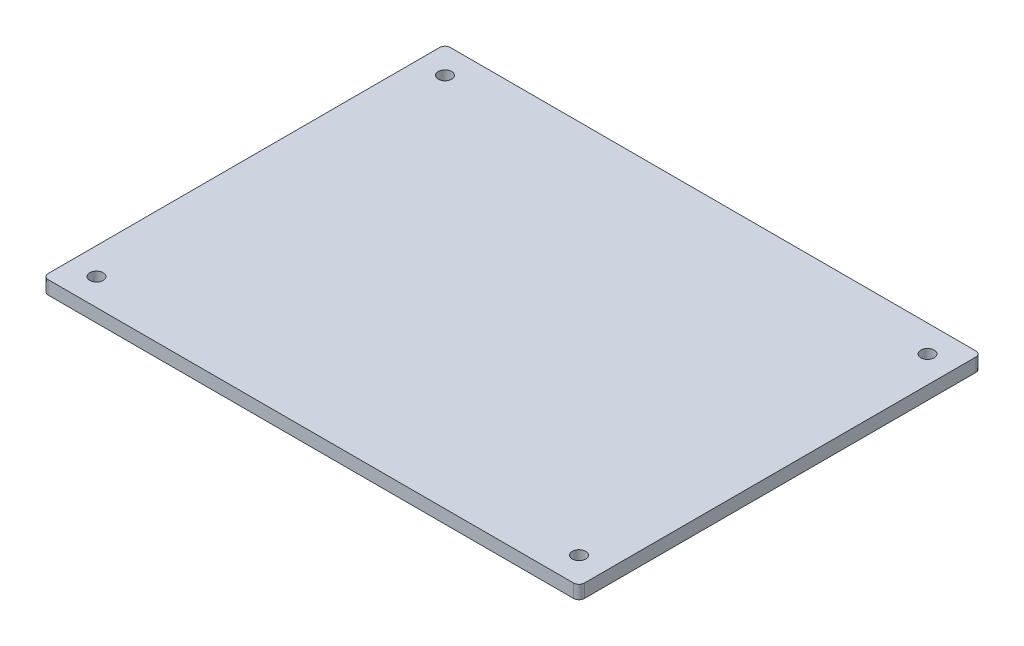
ISO-10303-21;
HEADER;
FILE_DESCRIPTION(('STEP AP214'),'2;1');
FILE_NAME('part.step','',(''),(''),'','','');
FILE_SCHEMA(('AUTOMOTIVE_DESIGN { 1 0 10303 214 1 1 1 1 }'));
ENDSEC;
DATA;
#1=APPLICATION_CONTEXT('core data for automotive mechanical design processes');
#2=APPLICATION_PROTOCOL_DEFINITION('international standard','automotive_design',2000,#1);
#3=PRODUCT_CONTEXT('',#1,'mechanical');
#4=PRODUCT('Part','Part','',(#3));
#5=PRODUCT_RELATED_PRODUCT_CATEGORY('part','',(#4));
#6=PRODUCT_DEFINITION_FORMATION('','',#4);
#7=PRODUCT_DEFINITION_CONTEXT('part definition',#1,'design');
#8=PRODUCT_DEFINITION('design','',#6,#7);
#9=PRODUCT_DEFINITION_SHAPE('','',#8);
#10=(LENGTH_UNIT() NAMED_UNIT(*) SI_UNIT(.MILLI.,.METRE.));
#11=(NAMED_UNIT(*) PLANE_ANGLE_UNIT() SI_UNIT($,.RADIAN.));
#12=(NAMED_UNIT(*) SI_UNIT($,.STERADIAN.) SOLID_ANGLE_UNIT());
#13=UNCERTAINTY_MEASURE_WITH_UNIT(LENGTH_MEASURE(1.E-05),#10,'distance_accuracy_value','');
#14=(GEOMETRIC_REPRESENTATION_CONTEXT(3) GLOBAL_UNCERTAINTY_ASSIGNED_CONTEXT((#13)) GLOBAL_UNIT_ASSIGNED_CONTEXT((#10,
#11,#12)) REPRESENTATION_CONTEXT('',''));
#15=CARTESIAN_POINT('',(0.,0.,0.));
#16=DIRECTION('',(0.,0.,1.));
#17=DIRECTION('',(1.,0.,0.));
#18=AXIS2_PLACEMENT_3D('',#15,#16,#17);
#19=CARTESIAN_POINT('',(0.,5.,0.));
#20=DIRECTION('',(1.,0.,0.));
#21=DIRECTION('',(0.,0.,-1.));
#22=AXIS2_PLACEMENT_3D('',#19,#20,#21);
#23=PLANE('',#22);
#24=DIRECTION('',(0.,0.,1.));
#25=VECTOR('',#24,1.);
#26=CARTESIAN_POINT('',(0.,0.,0.));
#27=LINE('',#26,#25);
#28=CARTESIAN_POINT('',(0.,0.,-148.));
#29=VERTEX_POINT('',#28);
#30=CARTESIAN_POINT('',(0.,0.,-2.));
#31=VERTEX_POINT('',#30);
#32=EDGE_CURVE('E130',#29,#31,#27,.T.);
#33=ORIENTED_EDGE('',*,*,#32,.T.);
#34=DIRECTION('',(0.,-1.,0.));
#35=VECTOR('',#34,1.);
#36=CARTESIAN_POINT('',(0.,5.,-2.));
#37=LINE('',#36,#35);
#38=CARTESIAN_POINT('',(0.,5.,-2.));
#39=VERTEX_POINT('',#38);
#40=EDGE_CURVE('E108',#31,#39,#37,.F.);
#41=ORIENTED_EDGE('',*,*,#40,.T.);
#42=DIRECTION('',(0.,0.,1.));
#43=VECTOR('',#42,1.);
#44=CARTESIAN_POINT('',(0.,5.,0.));
#45=LINE('',#44,#43);
#46=CARTESIAN_POINT('',(0.,5.,-148.));
#47=VERTEX_POINT('',#46);
#48=EDGE_CURVE('E140',#47,#39,#45,.T.);
#49=ORIENTED_EDGE('',*,*,#48,.F.);
#50=DIRECTION('',(0.,-1.,0.));
#51=VECTOR('',#50,1.);
#52=CARTESIAN_POINT('',(0.,5.,-148.));
#53=LINE('',#52,#51);
#54=EDGE_CURVE('E113',#47,#29,#53,.T.);
#55=ORIENTED_EDGE('',*,*,#54,.T.);
#56=EDGE_LOOP('',(#33,#41,#49,#55));
#57=FACE_BOUND('',#56,.T.);
#58=ADVANCED_FACE('F37',(#57),#23,.F.);
#59=CARTESIAN_POINT('',(0.,5.,0.));
#60=DIRECTION('',(0.,0.,-1.));
#61=DIRECTION('',(-1.,0.,0.));
#62=AXIS2_PLACEMENT_3D('',#59,#60,#61);
#63=PLANE('',#62);
#64=DIRECTION('',(1.,0.,0.));
#65=VECTOR('',#64,1.);
#66=CARTESIAN_POINT('',(0.,5.,0.));
#67=LINE('',#66,#65);
#68=CARTESIAN_POINT('',(2.,5.,0.));
#69=VERTEX_POINT('',#68);
#70=CARTESIAN_POINT('',(198.,5.,0.));
#71=VERTEX_POINT('',#70);
#72=EDGE_CURVE('E123',#69,#71,#67,.T.);
#73=ORIENTED_EDGE('',*,*,#72,.F.);
#74=DIRECTION('',(0.,-1.,0.));
#75=VECTOR('',#74,1.);
#76=CARTESIAN_POINT('',(2.,5.,0.));
#77=LINE('',#76,#75);
#78=CARTESIAN_POINT('',(2.,0.,0.));
#79=VERTEX_POINT('',#78);
#80=EDGE_CURVE('E107',#69,#79,#77,.T.);
#81=ORIENTED_EDGE('',*,*,#80,.T.);
#82=DIRECTION('',(1.,0.,0.));
#83=VECTOR('',#82,1.);
#84=CARTESIAN_POINT('',(0.,0.,0.));
#85=LINE('',#84,#83);
#86=CARTESIAN_POINT('',(198.,0.,0.));
#87=VERTEX_POINT('',#86);
#88=EDGE_CURVE('E120',#79,#87,#85,.T.);
#89=ORIENTED_EDGE('',*,*,#88,.T.);
#90=DIRECTION('',(0.,-1.,0.));
#91=VECTOR('',#90,1.);
#92=CARTESIAN_POINT('',(198.,5.,0.));
#93=LINE('',#92,#91);
#94=EDGE_CURVE('E125',#87,#71,#93,.F.);
#95=ORIENTED_EDGE('',*,*,#94,.T.);
#96=EDGE_LOOP('',(#73,#81,#89,#95));
#97=FACE_BOUND('',#96,.T.);
#98=ADVANCED_FACE('F119',(#97),#63,.F.);
#99=CARTESIAN_POINT('',(200.,5.,0.));
#100=DIRECTION('',(-1.,0.,0.));
#101=DIRECTION('',(0.,0.,1.));
#102=AXIS2_PLACEMENT_3D('',#99,#100,#101);
#103=PLANE('',#102);
#104=DIRECTION('',(0.,0.,-1.));
#105=VECTOR('',#104,1.);
#106=CARTESIAN_POINT('',(200.,0.,0.));
#107=LINE('',#106,#105);
#108=CARTESIAN_POINT('',(200.,0.,-2.));
#109=VERTEX_POINT('',#108);
#110=CARTESIAN_POINT('',(200.,0.,-148.));
#111=VERTEX_POINT('',#110);
#112=EDGE_CURVE('E129',#109,#111,#107,.T.);
#113=ORIENTED_EDGE('',*,*,#112,.T.);
#114=DIRECTION('',(0.,-1.,0.));
#115=VECTOR('',#114,1.);
#116=CARTESIAN_POINT('',(200.,5.,-148.));
#117=LINE('',#116,#115);
#118=CARTESIAN_POINT('',(200.,5.,-148.));
#119=VERTEX_POINT('',#118);
#120=EDGE_CURVE('E11',#111,#119,#117,.F.);
#121=ORIENTED_EDGE('',*,*,#120,.T.);
#122=DIRECTION('',(0.,0.,-1.));
#123=VECTOR('',#122,1.);
#124=CARTESIAN_POINT('',(200.,5.,0.));
#125=LINE('',#124,#123);
#126=CARTESIAN_POINT('',(200.,5.,-2.));
#127=VERTEX_POINT('',#126);
#128=EDGE_CURVE('E166',#127,#119,#125,.T.);
#129=ORIENTED_EDGE('',*,*,#128,.F.);
#130=DIRECTION('',(0.,-1.,0.));
#131=VECTOR('',#130,1.);
#132=CARTESIAN_POINT('',(200.,5.,-2.));
#133=LINE('',#132,#131);
#134=EDGE_CURVE('E45',#127,#109,#133,.T.);
#135=ORIENTED_EDGE('',*,*,#134,.T.);
#136=EDGE_LOOP('',(#113,#121,#129,#135));
#137=FACE_BOUND('',#136,.T.);
#138=ADVANCED_FACE('F164',(#137),#103,.F.);
#139=CARTESIAN_POINT('',(0.,5.,-150.));
#140=DIRECTION('',(0.,0.,1.));
#141=DIRECTION('',(1.,0.,0.));
#142=AXIS2_PLACEMENT_3D('',#139,#140,#141);
#143=PLANE('',#142);
#144=DIRECTION('',(-1.,0.,0.));
#145=VECTOR('',#144,1.);
#146=CARTESIAN_POINT('',(0.,0.,-150.));
#147=LINE('',#146,#145);
#148=CARTESIAN_POINT('',(198.,0.,-150.));
#149=VERTEX_POINT('',#148);
#150=CARTESIAN_POINT('',(2.,0.,-150.));
#151=VERTEX_POINT('',#150);
#152=EDGE_CURVE('E133',#149,#151,#147,.T.);
#153=ORIENTED_EDGE('',*,*,#152,.T.);
#154=DIRECTION('',(0.,-1.,0.));
#155=VECTOR('',#154,1.);
#156=CARTESIAN_POINT('',(2.,5.,-150.));
#157=LINE('',#156,#155);
#158=CARTESIAN_POINT('',(2.,5.,-150.));
#159=VERTEX_POINT('',#158);
#160=EDGE_CURVE('E52',#151,#159,#157,.F.);
#161=ORIENTED_EDGE('',*,*,#160,.T.);
#162=DIRECTION('',(-1.,0.,0.));
#163=VECTOR('',#162,1.);
#164=CARTESIAN_POINT('',(0.,5.,-150.));
#165=LINE('',#164,#163);
#166=CARTESIAN_POINT('',(198.,5.,-150.));
#167=VERTEX_POINT('',#166);
#168=EDGE_CURVE('E141',#167,#159,#165,.T.);
#169=ORIENTED_EDGE('',*,*,#168,.F.);
#170=DIRECTION('',(0.,-1.,0.));
#171=VECTOR('',#170,1.);
#172=CARTESIAN_POINT('',(198.,5.,-150.));
#173=LINE('',#172,#171);
#174=EDGE_CURVE('E157',#167,#149,#173,.T.);
#175=ORIENTED_EDGE('',*,*,#174,.T.);
#176=EDGE_LOOP('',(#153,#161,#169,#175));
#177=FACE_BOUND('',#176,.T.);
#178=ADVANCED_FACE('F173',(#177),#143,.F.);
#179=CARTESIAN_POINT('',(0.,5.,0.));
#180=DIRECTION('',(0.,-1.,0.));
#181=DIRECTION('',(0.,0.,-1.));
#182=AXIS2_PLACEMENT_3D('',#179,#180,#181);
#183=PLANE('',#182);
#184=CARTESIAN_POINT('',(10.,5.,-10.));
#185=DIRECTION('',(0.,1.,0.));
#186=DIRECTION('',(0.,0.,1.));
#187=AXIS2_PLACEMENT_3D('',#184,#185,#186);
#188=CIRCLE('',#187,2.5);
#189=CARTESIAN_POINT('',(10.,5.,-7.50000000000001));
#190=VERTEX_POINT('',#189);
#191=EDGE_CURVE('E186',#190,#190,#188,.T.);
#192=ORIENTED_EDGE('',*,*,#191,.F.);
#193=EDGE_LOOP('',(#192));
#194=FACE_BOUND('',#193,.T.);
#195=CARTESIAN_POINT('',(190.,5.,-10.));
#196=DIRECTION('',(0.,1.,0.));
#197=DIRECTION('',(0.,0.,1.));
#198=AXIS2_PLACEMENT_3D('',#195,#196,#197);
#199=CIRCLE('',#198,2.5);
#200=CARTESIAN_POINT('',(190.,5.,-7.50000000000002));
#201=VERTEX_POINT('',#200);
#202=EDGE_CURVE('E192',#201,#201,#199,.T.);
#203=ORIENTED_EDGE('',*,*,#202,.F.);
#204=EDGE_LOOP('',(#203));
#205=FACE_BOUND('',#204,.T.);
#206=CARTESIAN_POINT('',(190.,5.,-140.));
#207=DIRECTION('',(0.,1.,0.));
#208=DIRECTION('',(0.,0.,1.));
#209=AXIS2_PLACEMENT_3D('',#206,#207,#208);
#210=CIRCLE('',#209,2.5);
#211=CARTESIAN_POINT('',(190.,5.,-137.5));
#212=VERTEX_POINT('',#211);
#213=EDGE_CURVE('E198',#212,#212,#210,.T.);
#214=ORIENTED_EDGE('',*,*,#213,.F.);
#215=EDGE_LOOP('',(#214));
#216=FACE_BOUND('',#215,.T.);
#217=CARTESIAN_POINT('',(10.,5.,-140.));
#218=DIRECTION('',(0.,1.,0.));
#219=DIRECTION('',(0.,0.,1.));
#220=AXIS2_PLACEMENT_3D('',#217,#218,#219);
#221=CIRCLE('',#220,2.5);
#222=CARTESIAN_POINT('',(10.,5.,-137.5));
#223=VERTEX_POINT('',#222);
#224=EDGE_CURVE('E135',#223,#223,#221,.T.);
#225=ORIENTED_EDGE('',*,*,#224,.F.);
#226=EDGE_LOOP('',(#225));
#227=FACE_BOUND('',#226,.T.);
#228=ORIENTED_EDGE('',*,*,#48,.T.);
#229=CARTESIAN_POINT('',(2.,5.,-2.));
#230=DIRECTION('',(0.,-1.,0.));
#231=DIRECTION('',(0.,0.,-1.));
#232=AXIS2_PLACEMENT_3D('',#229,#230,#231);
#233=CIRCLE('',#232,2.);
#234=EDGE_CURVE('E155',#39,#69,#233,.F.);
#235=ORIENTED_EDGE('',*,*,#234,.T.);
#236=ORIENTED_EDGE('',*,*,#72,.T.);
#237=CARTESIAN_POINT('',(198.,5.,-2.));
#238=DIRECTION('',(0.,-1.,0.));
#239=DIRECTION('',(0.,0.,-1.));
#240=AXIS2_PLACEMENT_3D('',#237,#238,#239);
#241=CIRCLE('',#240,2.);
#242=EDGE_CURVE('E150',#71,#127,#241,.F.);
#243=ORIENTED_EDGE('',*,*,#242,.T.);
#244=ORIENTED_EDGE('',*,*,#128,.T.);
#245=CARTESIAN_POINT('',(198.,5.,-148.));
#246=DIRECTION('',(0.,-1.,0.));
#247=DIRECTION('',(0.,0.,-1.));
#248=AXIS2_PLACEMENT_3D('',#245,#246,#247);
#249=CIRCLE('',#248,2.);
#250=EDGE_CURVE('E59',#119,#167,#249,.F.);
#251=ORIENTED_EDGE('',*,*,#250,.T.);
#252=ORIENTED_EDGE('',*,*,#168,.T.);
#253=CARTESIAN_POINT('',(2.,5.,-148.));
#254=DIRECTION('',(0.,-1.,0.));
#255=DIRECTION('',(0.,0.,-1.));
#256=AXIS2_PLACEMENT_3D('',#253,#254,#255);
#257=CIRCLE('',#256,2.);
#258=EDGE_CURVE('E153',#159,#47,#257,.F.);
#259=ORIENTED_EDGE('',*,*,#258,.T.);
#260=EDGE_LOOP('',(#228,#235,#236,#243,#244,#251,#252,#259));
#261=FACE_BOUND('',#260,.T.);
#262=ADVANCED_FACE('F214',(#194,#205,#216,#227,#261),#183,.F.);
#263=CARTESIAN_POINT('',(0.,0.,0.));
#264=DIRECTION('',(0.,-1.,0.));
#265=DIRECTION('',(0.,0.,-1.));
#266=AXIS2_PLACEMENT_3D('',#263,#264,#265);
#267=PLANE('',#266);
#268=CARTESIAN_POINT('',(10.,0.,-10.));
#269=DIRECTION('',(0.,-1.,0.));
#270=DIRECTION('',(0.,0.,-1.));
#271=AXIS2_PLACEMENT_3D('',#268,#269,#270);
#272=CIRCLE('',#271,2.5);
#273=CARTESIAN_POINT('',(10.,0.,-12.5));
#274=VERTEX_POINT('',#273);
#275=EDGE_CURVE('E189',#274,#274,#272,.F.);
#276=ORIENTED_EDGE('',*,*,#275,.T.);
#277=EDGE_LOOP('',(#276));
#278=FACE_BOUND('',#277,.T.);
#279=CARTESIAN_POINT('',(190.,0.,-10.));
#280=DIRECTION('',(0.,-1.,0.));
#281=DIRECTION('',(0.,0.,-1.));
#282=AXIS2_PLACEMENT_3D('',#279,#280,#281);
#283=CIRCLE('',#282,2.5);
#284=CARTESIAN_POINT('',(190.,0.,-12.5));
#285=VERTEX_POINT('',#284);
#286=EDGE_CURVE('E195',#285,#285,#283,.F.);
#287=ORIENTED_EDGE('',*,*,#286,.T.);
#288=EDGE_LOOP('',(#287));
#289=FACE_BOUND('',#288,.T.);
#290=CARTESIAN_POINT('',(190.,0.,-140.));
#291=DIRECTION('',(0.,-1.,0.));
#292=DIRECTION('',(0.,0.,-1.));
#293=AXIS2_PLACEMENT_3D('',#290,#291,#292);
#294=CIRCLE('',#293,2.5);
#295=CARTESIAN_POINT('',(190.,0.,-142.5));
#296=VERTEX_POINT('',#295);
#297=EDGE_CURVE('E183',#296,#296,#294,.F.);
#298=ORIENTED_EDGE('',*,*,#297,.T.);
#299=EDGE_LOOP('',(#298));
#300=FACE_BOUND('',#299,.T.);
#301=CARTESIAN_POINT('',(10.,0.,-140.));
#302=DIRECTION('',(0.,-1.,0.));
#303=DIRECTION('',(0.,0.,-1.));
#304=AXIS2_PLACEMENT_3D('',#301,#302,#303);
#305=CIRCLE('',#304,2.5);
#306=CARTESIAN_POINT('',(10.,0.,-142.5));
#307=VERTEX_POINT('',#306);
#308=EDGE_CURVE('E180',#307,#307,#305,.F.);
#309=ORIENTED_EDGE('',*,*,#308,.T.);
#310=EDGE_LOOP('',(#309));
#311=FACE_BOUND('',#310,.T.);
#312=ORIENTED_EDGE('',*,*,#88,.F.);
#313=CARTESIAN_POINT('',(2.,0.,-2.));
#314=DIRECTION('',(0.,-1.,0.));
#315=DIRECTION('',(0.,0.,-1.));
#316=AXIS2_PLACEMENT_3D('',#313,#314,#315);
#317=CIRCLE('',#316,2.);
#318=EDGE_CURVE('E103',#79,#31,#317,.T.);
#319=ORIENTED_EDGE('',*,*,#318,.T.);
#320=ORIENTED_EDGE('',*,*,#32,.F.);
#321=CARTESIAN_POINT('',(2.,0.,-148.));
#322=DIRECTION('',(0.,-1.,0.));
#323=DIRECTION('',(0.,0.,-1.));
#324=AXIS2_PLACEMENT_3D('',#321,#322,#323);
#325=CIRCLE('',#324,2.);
#326=EDGE_CURVE('E114',#29,#151,#325,.T.);
#327=ORIENTED_EDGE('',*,*,#326,.T.);
#328=ORIENTED_EDGE('',*,*,#152,.F.);
#329=CARTESIAN_POINT('',(198.,0.,-148.));
#330=DIRECTION('',(0.,-1.,0.));
#331=DIRECTION('',(0.,0.,-1.));
#332=AXIS2_PLACEMENT_3D('',#329,#330,#331);
#333=CIRCLE('',#332,2.);
#334=EDGE_CURVE('E144',#149,#111,#333,.T.);
#335=ORIENTED_EDGE('',*,*,#334,.T.);
#336=ORIENTED_EDGE('',*,*,#112,.F.);
#337=CARTESIAN_POINT('',(198.,0.,-2.));
#338=DIRECTION('',(0.,-1.,0.));
#339=DIRECTION('',(0.,0.,-1.));
#340=AXIS2_PLACEMENT_3D('',#337,#338,#339);
#341=CIRCLE('',#340,2.);
#342=EDGE_CURVE('E124',#109,#87,#341,.T.);
#343=ORIENTED_EDGE('',*,*,#342,.T.);
#344=EDGE_LOOP('',(#312,#319,#320,#327,#328,#335,#336,#343));
#345=FACE_BOUND('',#344,.T.);
#346=ADVANCED_FACE('F127',(#278,#289,#300,#311,#345),#267,.T.);
#347=CARTESIAN_POINT('',(2.,5.,-2.));
#348=DIRECTION('',(0.,-1.,0.));
#349=DIRECTION('',(0.,0.,-1.));
#350=AXIS2_PLACEMENT_3D('',#347,#348,#349);
#351=CYLINDRICAL_SURFACE('',#350,2.);
#352=ORIENTED_EDGE('',*,*,#234,.F.);
#353=ORIENTED_EDGE('',*,*,#40,.F.);
#354=ORIENTED_EDGE('',*,*,#318,.F.);
#355=ORIENTED_EDGE('',*,*,#80,.F.);
#356=EDGE_LOOP('',(#352,#353,#354,#355));
#357=FACE_BOUND('',#356,.T.);
#358=ADVANCED_FACE('F106',(#357),#351,.T.);
#359=CARTESIAN_POINT('',(2.,5.,-148.));
#360=DIRECTION('',(0.,-1.,0.));
#361=DIRECTION('',(0.,0.,-1.));
#362=AXIS2_PLACEMENT_3D('',#359,#360,#361);
#363=CYLINDRICAL_SURFACE('',#362,2.);
#364=ORIENTED_EDGE('',*,*,#258,.F.);
#365=ORIENTED_EDGE('',*,*,#160,.F.);
#366=ORIENTED_EDGE('',*,*,#326,.F.);
#367=ORIENTED_EDGE('',*,*,#54,.F.);
#368=EDGE_LOOP('',(#364,#365,#366,#367));
#369=FACE_BOUND('',#368,.T.);
#370=ADVANCED_FACE('F224',(#369),#363,.T.);
#371=CARTESIAN_POINT('',(198.,5.,-148.));
#372=DIRECTION('',(0.,-1.,0.));
#373=DIRECTION('',(0.,0.,-1.));
#374=AXIS2_PLACEMENT_3D('',#371,#372,#373);
#375=CYLINDRICAL_SURFACE('',#374,2.);
#376=ORIENTED_EDGE('',*,*,#250,.F.);
#377=ORIENTED_EDGE('',*,*,#120,.F.);
#378=ORIENTED_EDGE('',*,*,#334,.F.);
#379=ORIENTED_EDGE('',*,*,#174,.F.);
#380=EDGE_LOOP('',(#376,#377,#378,#379));
#381=FACE_BOUND('',#380,.T.);
#382=ADVANCED_FACE('F172',(#381),#375,.T.);
#383=CARTESIAN_POINT('',(198.,5.,-2.));
#384=DIRECTION('',(0.,-1.,0.));
#385=DIRECTION('',(0.,0.,-1.));
#386=AXIS2_PLACEMENT_3D('',#383,#384,#385);
#387=CYLINDRICAL_SURFACE('',#386,2.);
#388=ORIENTED_EDGE('',*,*,#242,.F.);
#389=ORIENTED_EDGE('',*,*,#94,.F.);
#390=ORIENTED_EDGE('',*,*,#342,.F.);
#391=ORIENTED_EDGE('',*,*,#134,.F.);
#392=EDGE_LOOP('',(#388,#389,#390,#391));
#393=FACE_BOUND('',#392,.T.);
#394=ADVANCED_FACE('F39',(#393),#387,.T.);
#395=CARTESIAN_POINT('',(10.,-0.00100000000000013,-140.));
#396=DIRECTION('',(0.,1.,0.));
#397=DIRECTION('',(0.,0.,1.));
#398=AXIS2_PLACEMENT_3D('',#395,#396,#397);
#399=CYLINDRICAL_SURFACE('',#398,2.5);
#400=ORIENTED_EDGE('',*,*,#308,.F.);
#401=EDGE_LOOP('',(#400));
#402=FACE_BOUND('',#401,.T.);
#403=ORIENTED_EDGE('',*,*,#224,.T.);
#404=EDGE_LOOP('',(#403));
#405=FACE_BOUND('',#404,.T.);
#406=ADVANCED_FACE('F210',(#402,#405),#399,.F.);
#407=CARTESIAN_POINT('',(190.,-0.00100000000000013,-140.));
#408=DIRECTION('',(0.,1.,0.));
#409=DIRECTION('',(0.,0.,1.));
#410=AXIS2_PLACEMENT_3D('',#407,#408,#409);
#411=CYLINDRICAL_SURFACE('',#410,2.5);
#412=ORIENTED_EDGE('',*,*,#297,.F.);
#413=EDGE_LOOP('',(#412));
#414=FACE_BOUND('',#413,.T.);
#415=ORIENTED_EDGE('',*,*,#213,.T.);
#416=EDGE_LOOP('',(#415));
#417=FACE_BOUND('',#416,.T.);
#418=ADVANCED_FACE('F206',(#414,#417),#411,.F.);
#419=CARTESIAN_POINT('',(190.,-0.00100000000000013,-10.));
#420=DIRECTION('',(0.,1.,0.));
#421=DIRECTION('',(0.,0.,1.));
#422=AXIS2_PLACEMENT_3D('',#419,#420,#421);
#423=CYLINDRICAL_SURFACE('',#422,2.5);
#424=ORIENTED_EDGE('',*,*,#286,.F.);
#425=EDGE_LOOP('',(#424));
#426=FACE_BOUND('',#425,.T.);
#427=ORIENTED_EDGE('',*,*,#202,.T.);
#428=EDGE_LOOP('',(#427));
#429=FACE_BOUND('',#428,.T.);
#430=ADVANCED_FACE('F209',(#426,#429),#423,.F.);
#431=CARTESIAN_POINT('',(10.,-0.00100000000000013,-10.));
#432=DIRECTION('',(0.,1.,0.));
#433=DIRECTION('',(0.,0.,1.));
#434=AXIS2_PLACEMENT_3D('',#431,#432,#433);
#435=CYLINDRICAL_SURFACE('',#434,2.5);
#436=ORIENTED_EDGE('',*,*,#275,.F.);
#437=EDGE_LOOP('',(#436));
#438=FACE_BOUND('',#437,.T.);
#439=ORIENTED_EDGE('',*,*,#191,.T.);
#440=EDGE_LOOP('',(#439));
#441=FACE_BOUND('',#440,.T.);
#442=ADVANCED_FACE('F249',(#438,#441),#435,.F.);
#443=CLOSED_SHELL('',(#58,#98,#138,#178,#262,#346,#358,#370,#382,#394,#406,#418,#430,#442));
#444=MANIFOLD_SOLID_BREP('B2',#443);
#445=ADVANCED_BREP_SHAPE_REPRESENTATION('',(#18,#444),#14);
#446=SHAPE_DEFINITION_REPRESENTATION(#9,#445);
ENDSEC;
END-ISO-10303-21;
